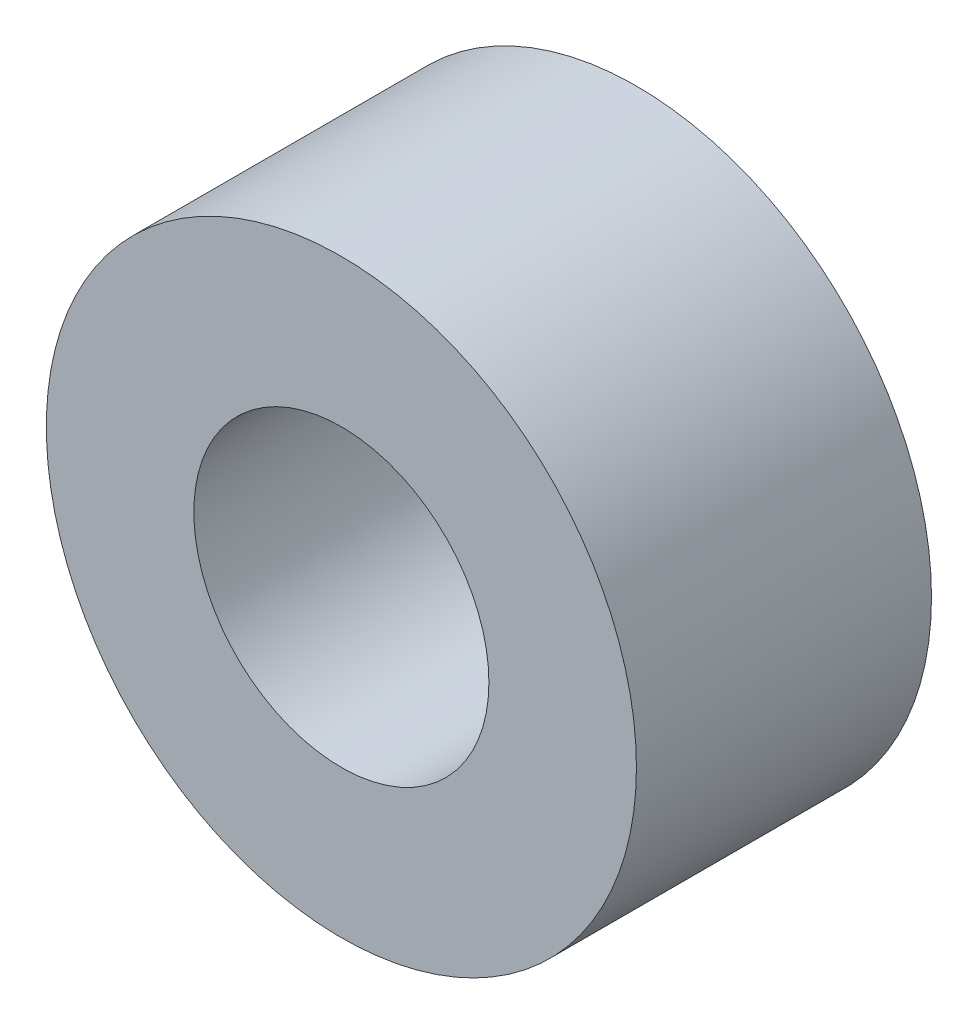
ISO-10303-21;
HEADER;
FILE_DESCRIPTION(('STEP AP214'),'2;1');
FILE_NAME('part.step','',(''),(''),'','','');
FILE_SCHEMA(('AUTOMOTIVE_DESIGN { 1 0 10303 214 1 1 1 1 }'));
ENDSEC;
DATA;
#1=APPLICATION_CONTEXT('core data for automotive mechanical design processes');
#2=APPLICATION_PROTOCOL_DEFINITION('international standard','automotive_design',2000,#1);
#3=PRODUCT_CONTEXT('',#1,'mechanical');
#4=PRODUCT('Part','Part','',(#3));
#5=PRODUCT_RELATED_PRODUCT_CATEGORY('part','',(#4));
#6=PRODUCT_DEFINITION_FORMATION('','',#4);
#7=PRODUCT_DEFINITION_CONTEXT('part definition',#1,'design');
#8=PRODUCT_DEFINITION('design','',#6,#7);
#9=PRODUCT_DEFINITION_SHAPE('','',#8);
#10=(LENGTH_UNIT() NAMED_UNIT(*) SI_UNIT(.MILLI.,.METRE.));
#11=(NAMED_UNIT(*) PLANE_ANGLE_UNIT() SI_UNIT($,.RADIAN.));
#12=(NAMED_UNIT(*) SI_UNIT($,.STERADIAN.) SOLID_ANGLE_UNIT());
#13=UNCERTAINTY_MEASURE_WITH_UNIT(LENGTH_MEASURE(1.E-05),#10,'distance_accuracy_value','');
#14=(GEOMETRIC_REPRESENTATION_CONTEXT(3) GLOBAL_UNCERTAINTY_ASSIGNED_CONTEXT((#13)) GLOBAL_UNIT_ASSIGNED_CONTEXT((#10,
#11,#12)) REPRESENTATION_CONTEXT('',''));
#15=CARTESIAN_POINT('',(0.,0.,0.));
#16=DIRECTION('',(0.,0.,1.));
#17=DIRECTION('',(1.,0.,0.));
#18=AXIS2_PLACEMENT_3D('',#15,#16,#17);
#19=CARTESIAN_POINT('',(0.,0.,10.));
#20=DIRECTION('',(0.,0.,-1.));
#21=DIRECTION('',(-1.,0.,0.));
#22=AXIS2_PLACEMENT_3D('',#19,#20,#21);
#23=CYLINDRICAL_SURFACE('',#22,10.);
#24=CARTESIAN_POINT('',(0.,0.,10.));
#25=DIRECTION('',(0.,0.,1.));
#26=DIRECTION('',(1.,0.,0.));
#27=AXIS2_PLACEMENT_3D('',#24,#25,#26);
#28=CIRCLE('',#27,10.);
#29=CARTESIAN_POINT('',(10.,0.,10.));
#30=VERTEX_POINT('',#29);
#31=EDGE_CURVE('E10',#30,#30,#28,.T.);
#32=ORIENTED_EDGE('',*,*,#31,.F.);
#33=EDGE_LOOP('',(#32));
#34=FACE_BOUND('',#33,.T.);
#35=CARTESIAN_POINT('',(0.,0.,0.));
#36=DIRECTION('',(0.,0.,1.));
#37=DIRECTION('',(1.,0.,0.));
#38=AXIS2_PLACEMENT_3D('',#35,#36,#37);
#39=CIRCLE('',#38,10.);
#40=CARTESIAN_POINT('',(10.,0.,0.));
#41=VERTEX_POINT('',#40);
#42=EDGE_CURVE('E37',#41,#41,#39,.T.);
#43=ORIENTED_EDGE('',*,*,#42,.T.);
#44=EDGE_LOOP('',(#43));
#45=FACE_BOUND('',#44,.T.);
#46=ADVANCED_FACE('F31',(#34,#45),#23,.T.);
#47=CARTESIAN_POINT('',(0.,0.,10.));
#48=DIRECTION('',(0.,0.,1.));
#49=DIRECTION('',(1.,0.,0.));
#50=AXIS2_PLACEMENT_3D('',#47,#48,#49);
#51=PLANE('',#50);
#52=CARTESIAN_POINT('',(0.,0.,10.));
#53=DIRECTION('',(0.,0.,1.));
#54=DIRECTION('',(1.,0.,0.));
#55=AXIS2_PLACEMENT_3D('',#52,#53,#54);
#56=CIRCLE('',#55,5.);
#57=CARTESIAN_POINT('',(5.,0.,10.));
#58=VERTEX_POINT('',#57);
#59=EDGE_CURVE('E45',#58,#58,#56,.T.);
#60=ORIENTED_EDGE('',*,*,#59,.F.);
#61=EDGE_LOOP('',(#60));
#62=FACE_BOUND('',#61,.T.);
#63=ORIENTED_EDGE('',*,*,#31,.T.);
#64=EDGE_LOOP('',(#63));
#65=FACE_BOUND('',#64,.T.);
#66=ADVANCED_FACE('F53',(#62,#65),#51,.T.);
#67=CARTESIAN_POINT('',(0.,0.,0.));
#68=DIRECTION('',(0.,0.,1.));
#69=DIRECTION('',(1.,0.,0.));
#70=AXIS2_PLACEMENT_3D('',#67,#68,#69);
#71=PLANE('',#70);
#72=CARTESIAN_POINT('',(0.,0.,0.));
#73=DIRECTION('',(0.,0.,1.));
#74=DIRECTION('',(1.,0.,0.));
#75=AXIS2_PLACEMENT_3D('',#72,#73,#74);
#76=CIRCLE('',#75,5.);
#77=CARTESIAN_POINT('',(5.,0.,0.));
#78=VERTEX_POINT('',#77);
#79=EDGE_CURVE('E41',#78,#78,#76,.T.);
#80=ORIENTED_EDGE('',*,*,#79,.T.);
#81=EDGE_LOOP('',(#80));
#82=FACE_BOUND('',#81,.T.);
#83=ORIENTED_EDGE('',*,*,#42,.F.);
#84=EDGE_LOOP('',(#83));
#85=FACE_BOUND('',#84,.T.);
#86=ADVANCED_FACE('F55',(#82,#85),#71,.F.);
#87=CARTESIAN_POINT('',(0.,0.,0.));
#88=DIRECTION('',(0.,0.,1.));
#89=DIRECTION('',(1.,0.,0.));
#90=AXIS2_PLACEMENT_3D('',#87,#88,#89);
#91=CYLINDRICAL_SURFACE('',#90,5.);
#92=ORIENTED_EDGE('',*,*,#79,.F.);
#93=EDGE_LOOP('',(#92));
#94=FACE_BOUND('',#93,.T.);
#95=ORIENTED_EDGE('',*,*,#59,.T.);
#96=EDGE_LOOP('',(#95));
#97=FACE_BOUND('',#96,.T.);
#98=ADVANCED_FACE('F51',(#94,#97),#91,.F.);
#99=CLOSED_SHELL('',(#46,#66,#86,#98));
#100=MANIFOLD_SOLID_BREP('B2',#99);
#101=ADVANCED_BREP_SHAPE_REPRESENTATION('',(#18,#100),#14);
#102=SHAPE_DEFINITION_REPRESENTATION(#9,#101);
ENDSEC;
END-ISO-10303-21;
